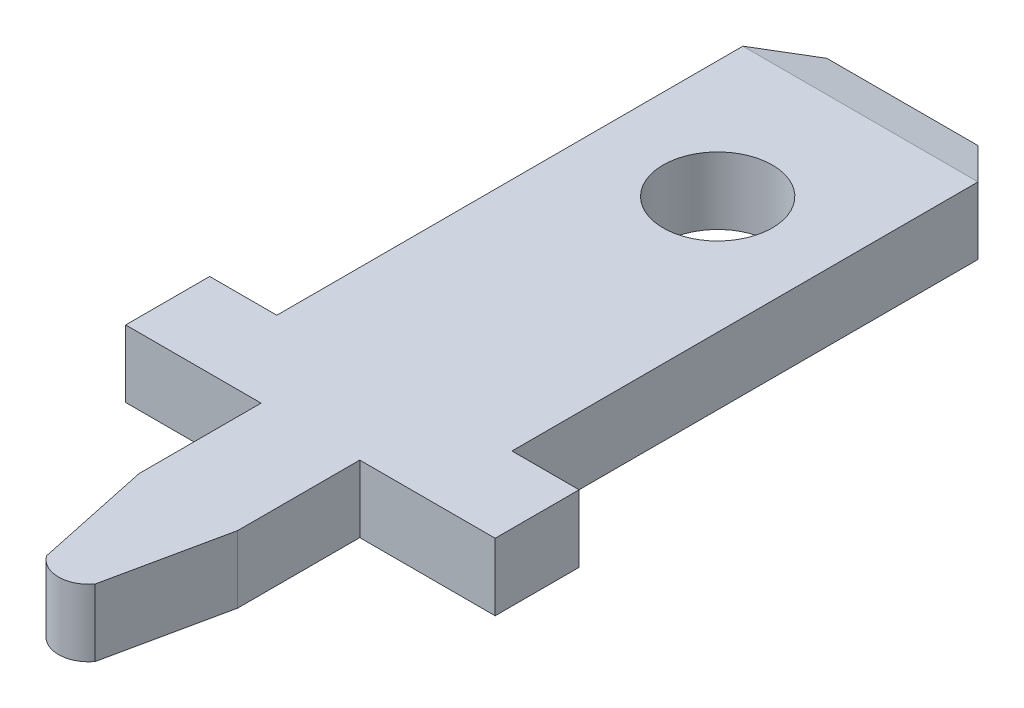
ISO-10303-21;
HEADER;
FILE_DESCRIPTION(('STEP AP214'),'2;1');
FILE_NAME('part.step','',(''),(''),'','','');
FILE_SCHEMA(('AUTOMOTIVE_DESIGN { 1 0 10303 214 1 1 1 1 }'));
ENDSEC;
DATA;
#1=APPLICATION_CONTEXT('core data for automotive mechanical design processes');
#2=APPLICATION_PROTOCOL_DEFINITION('international standard','automotive_design',2000,#1);
#3=PRODUCT_CONTEXT('',#1,'mechanical');
#4=PRODUCT('Part','Part','',(#3));
#5=PRODUCT_RELATED_PRODUCT_CATEGORY('part','',(#4));
#6=PRODUCT_DEFINITION_FORMATION('','',#4);
#7=PRODUCT_DEFINITION_CONTEXT('part definition',#1,'design');
#8=PRODUCT_DEFINITION('design','',#6,#7);
#9=PRODUCT_DEFINITION_SHAPE('','',#8);
#10=(LENGTH_UNIT() NAMED_UNIT(*) SI_UNIT(.MILLI.,.METRE.));
#11=(NAMED_UNIT(*) PLANE_ANGLE_UNIT() SI_UNIT($,.RADIAN.));
#12=(NAMED_UNIT(*) SI_UNIT($,.STERADIAN.) SOLID_ANGLE_UNIT());
#13=UNCERTAINTY_MEASURE_WITH_UNIT(LENGTH_MEASURE(1.E-05),#10,'distance_accuracy_value','');
#14=(GEOMETRIC_REPRESENTATION_CONTEXT(3) GLOBAL_UNCERTAINTY_ASSIGNED_CONTEXT((#13)) GLOBAL_UNIT_ASSIGNED_CONTEXT((#10,
#11,#12)) REPRESENTATION_CONTEXT('',''));
#15=CARTESIAN_POINT('',(0.,0.,0.));
#16=DIRECTION('',(0.,0.,1.));
#17=DIRECTION('',(1.,0.,0.));
#18=AXIS2_PLACEMENT_3D('',#15,#16,#17);
#19=CARTESIAN_POINT('',(-1.4,0.,-6.55));
#20=DIRECTION('',(0.,0.970142500145338,-0.242535625036309));
#21=DIRECTION('',(0.,0.242535625036309,0.970142500145338));
#22=AXIS2_PLACEMENT_3D('',#19,#20,#21);
#23=PLANE('',#22);
#24=DIRECTION('',(0.696310623822791,-0.174077655955698,-0.696310623822791));
#25=VECTOR('',#24,1.);
#26=CARTESIAN_POINT('',(-1.4,0.,-6.55));
#27=LINE('',#26,#25);
#28=CARTESIAN_POINT('',(-1.4,0.,-6.55));
#29=VERTEX_POINT('',#28);
#30=CARTESIAN_POINT('',(-0.9,-0.124999999999994,-7.05));
#31=VERTEX_POINT('',#30);
#32=EDGE_CURVE('E210',#29,#31,#27,.T.);
#33=ORIENTED_EDGE('',*,*,#32,.F.);
#34=DIRECTION('',(1.,0.,0.));
#35=VECTOR('',#34,1.);
#36=CARTESIAN_POINT('',(0.,0.,-6.55));
#37=LINE('',#36,#35);
#38=CARTESIAN_POINT('',(1.4,0.,-6.55));
#39=VERTEX_POINT('',#38);
#40=EDGE_CURVE('E191',#29,#39,#37,.T.);
#41=ORIENTED_EDGE('',*,*,#40,.T.);
#42=DIRECTION('',(0.696310623822791,0.174077655955698,0.696310623822791));
#43=VECTOR('',#42,1.);
#44=CARTESIAN_POINT('',(0.9,-0.125,-7.05));
#45=LINE('',#44,#43);
#46=CARTESIAN_POINT('',(0.9,-0.124999999999997,-7.05));
#47=VERTEX_POINT('',#46);
#48=EDGE_CURVE('E193',#47,#39,#45,.T.);
#49=ORIENTED_EDGE('',*,*,#48,.F.);
#50=DIRECTION('',(-1.,0.,0.));
#51=VECTOR('',#50,1.);
#52=CARTESIAN_POINT('',(-1.4,-0.125,-7.05));
#53=LINE('',#52,#51);
#54=EDGE_CURVE('E213',#31,#47,#53,.F.);
#55=ORIENTED_EDGE('',*,*,#54,.F.);
#56=EDGE_LOOP('',(#33,#41,#49,#55));
#57=FACE_BOUND('',#56,.T.);
#58=ADVANCED_FACE('F16',(#57),#23,.T.);
#59=CARTESIAN_POINT('',(-1.4,0.,-7.05));
#60=DIRECTION('',(0.,0.,-1.));
#61=DIRECTION('',(-1.,0.,0.));
#62=AXIS2_PLACEMENT_3D('',#59,#60,#61);
#63=PLANE('',#62);
#64=DIRECTION('',(0.,1.,0.));
#65=VECTOR('',#64,1.);
#66=CARTESIAN_POINT('',(-0.9,0.,-7.05));
#67=LINE('',#66,#65);
#68=CARTESIAN_POINT('',(-0.9,-0.675000000000003,-7.05));
#69=VERTEX_POINT('',#68);
#70=EDGE_CURVE('E207',#31,#69,#67,.F.);
#71=ORIENTED_EDGE('',*,*,#70,.F.);
#72=ORIENTED_EDGE('',*,*,#54,.T.);
#73=DIRECTION('',(0.,1.,0.));
#74=VECTOR('',#73,1.);
#75=CARTESIAN_POINT('',(0.9,0.,-7.05));
#76=LINE('',#75,#74);
#77=CARTESIAN_POINT('',(0.9,-0.675000000000003,-7.05));
#78=VERTEX_POINT('',#77);
#79=EDGE_CURVE('E204',#78,#47,#76,.T.);
#80=ORIENTED_EDGE('',*,*,#79,.F.);
#81=DIRECTION('',(1.,0.,0.));
#82=VECTOR('',#81,1.);
#83=CARTESIAN_POINT('',(-1.4,-0.675000000000012,-7.05));
#84=LINE('',#83,#82);
#85=EDGE_CURVE('E310',#78,#69,#84,.F.);
#86=ORIENTED_EDGE('',*,*,#85,.T.);
#87=EDGE_LOOP('',(#71,#72,#80,#86));
#88=FACE_BOUND('',#87,.T.);
#89=ADVANCED_FACE('F299',(#88),#63,.T.);
#90=CARTESIAN_POINT('',(-0.9,0.,-7.05));
#91=DIRECTION('',(-0.707106781186548,0.,-0.707106781186548));
#92=DIRECTION('',(-0.707106781186548,0.,0.707106781186548));
#93=AXIS2_PLACEMENT_3D('',#90,#91,#92);
#94=PLANE('',#93);
#95=ORIENTED_EDGE('',*,*,#32,.T.);
#96=ORIENTED_EDGE('',*,*,#70,.T.);
#97=DIRECTION('',(-0.696310623822791,-0.174077655955681,0.696310623822796));
#98=VECTOR('',#97,1.);
#99=CARTESIAN_POINT('',(-0.9,-0.675000000000012,-7.05));
#100=LINE('',#99,#98);
#101=CARTESIAN_POINT('',(-1.4,-0.8,-6.55));
#102=VERTEX_POINT('',#101);
#103=EDGE_CURVE('E326',#69,#102,#100,.T.);
#104=ORIENTED_EDGE('',*,*,#103,.T.);
#105=DIRECTION('',(0.,1.,0.));
#106=VECTOR('',#105,1.);
#107=CARTESIAN_POINT('',(-1.4,0.,-6.55));
#108=LINE('',#107,#106);
#109=EDGE_CURVE('E314',#29,#102,#108,.F.);
#110=ORIENTED_EDGE('',*,*,#109,.F.);
#111=EDGE_LOOP('',(#95,#96,#104,#110));
#112=FACE_BOUND('',#111,.T.);
#113=ADVANCED_FACE('F296',(#112),#94,.T.);
#114=CARTESIAN_POINT('',(1.4,0.,-6.55));
#115=DIRECTION('',(0.707106781186548,0.,-0.707106781186548));
#116=DIRECTION('',(-0.707106781186548,0.,-0.707106781186548));
#117=AXIS2_PLACEMENT_3D('',#114,#115,#116);
#118=PLANE('',#117);
#119=ORIENTED_EDGE('',*,*,#48,.T.);
#120=DIRECTION('',(0.,1.,0.));
#121=VECTOR('',#120,1.);
#122=CARTESIAN_POINT('',(1.4,0.,-6.55));
#123=LINE('',#122,#121);
#124=CARTESIAN_POINT('',(1.4,-0.8,-6.55));
#125=VERTEX_POINT('',#124);
#126=EDGE_CURVE('E321',#125,#39,#123,.T.);
#127=ORIENTED_EDGE('',*,*,#126,.F.);
#128=DIRECTION('',(-0.696310623822791,0.174077655955681,-0.696310623822796));
#129=VECTOR('',#128,1.);
#130=CARTESIAN_POINT('',(1.4,-0.8,-6.55));
#131=LINE('',#130,#129);
#132=EDGE_CURVE('E319',#125,#78,#131,.T.);
#133=ORIENTED_EDGE('',*,*,#132,.T.);
#134=ORIENTED_EDGE('',*,*,#79,.T.);
#135=EDGE_LOOP('',(#119,#127,#133,#134));
#136=FACE_BOUND('',#135,.T.);
#137=ADVANCED_FACE('F293',(#136),#118,.T.);
#138=CARTESIAN_POINT('',(0.,0.,0.));
#139=DIRECTION('',(0.,-1.,0.));
#140=DIRECTION('',(0.,0.,-1.));
#141=AXIS2_PLACEMENT_3D('',#138,#139,#140);
#142=PLANE('',#141);
#143=CARTESIAN_POINT('',(0.,0.,-4.85));
#144=DIRECTION('',(0.,-1.,0.));
#145=DIRECTION('',(0.,0.,-1.));
#146=AXIS2_PLACEMENT_3D('',#143,#144,#145);
#147=CIRCLE('',#146,0.65);
#148=CARTESIAN_POINT('',(0.,0.,-5.5));
#149=VERTEX_POINT('',#148);
#150=EDGE_CURVE('E177',#149,#149,#147,.T.);
#151=ORIENTED_EDGE('',*,*,#150,.T.);
#152=EDGE_LOOP('',(#151));
#153=FACE_BOUND('',#152,.T.);
#154=DIRECTION('',(-1.,0.,0.));
#155=VECTOR('',#154,1.);
#156=CARTESIAN_POINT('',(1.4,0.,-1.));
#157=LINE('',#156,#155);
#158=CARTESIAN_POINT('',(1.4,0.,-1.));
#159=VERTEX_POINT('',#158);
#160=CARTESIAN_POINT('',(2.2,0.,-1.));
#161=VERTEX_POINT('',#160);
#162=EDGE_CURVE('E378',#159,#161,#157,.F.);
#163=ORIENTED_EDGE('',*,*,#162,.F.);
#164=DIRECTION('',(0.,0.,-1.));
#165=VECTOR('',#164,1.);
#166=CARTESIAN_POINT('',(1.4,0.,-7.05));
#167=LINE('',#166,#165);
#168=EDGE_CURVE('E383',#39,#159,#167,.F.);
#169=ORIENTED_EDGE('',*,*,#168,.F.);
#170=ORIENTED_EDGE('',*,*,#40,.F.);
#171=DIRECTION('',(0.,0.,1.));
#172=VECTOR('',#171,1.);
#173=CARTESIAN_POINT('',(-1.4,0.,-1.));
#174=LINE('',#173,#172);
#175=CARTESIAN_POINT('',(-1.4,0.,-1.));
#176=VERTEX_POINT('',#175);
#177=EDGE_CURVE('E324',#176,#29,#174,.F.);
#178=ORIENTED_EDGE('',*,*,#177,.F.);
#179=DIRECTION('',(-1.,0.,0.));
#180=VECTOR('',#179,1.);
#181=CARTESIAN_POINT('',(-2.2,0.,-1.));
#182=LINE('',#181,#180);
#183=CARTESIAN_POINT('',(-2.2,0.,-1.));
#184=VERTEX_POINT('',#183);
#185=EDGE_CURVE('E337',#184,#176,#182,.F.);
#186=ORIENTED_EDGE('',*,*,#185,.F.);
#187=DIRECTION('',(0.,0.,1.));
#188=VECTOR('',#187,1.);
#189=CARTESIAN_POINT('',(-2.2,0.,0.));
#190=LINE('',#189,#188);
#191=CARTESIAN_POINT('',(-2.2,0.,0.));
#192=VERTEX_POINT('',#191);
#193=EDGE_CURVE('E342',#192,#184,#190,.F.);
#194=ORIENTED_EDGE('',*,*,#193,.F.);
#195=DIRECTION('',(1.,0.,0.));
#196=VECTOR('',#195,1.);
#197=CARTESIAN_POINT('',(-0.5875,0.,0.));
#198=LINE('',#197,#196);
#199=CARTESIAN_POINT('',(-0.5875,0.,0.));
#200=VERTEX_POINT('',#199);
#201=EDGE_CURVE('E346',#200,#192,#198,.F.);
#202=ORIENTED_EDGE('',*,*,#201,.F.);
#203=DIRECTION('',(0.,0.,1.));
#204=VECTOR('',#203,1.);
#205=CARTESIAN_POINT('',(-0.5875,0.,1.453414905303));
#206=LINE('',#205,#204);
#207=CARTESIAN_POINT('',(-0.587500000000029,0.,1.45341490530301));
#208=VERTEX_POINT('',#207);
#209=EDGE_CURVE('E144',#208,#200,#206,.F.);
#210=ORIENTED_EDGE('',*,*,#209,.F.);
#211=DIRECTION('',(0.207911690817799,0.,0.978147600733797));
#212=VECTOR('',#211,1.);
#213=CARTESIAN_POINT('',(-0.289920813662,0.,2.853414905303));
#214=LINE('',#213,#212);
#215=CARTESIAN_POINT('',(-0.289920813661974,0.,2.85341490530312));
#216=VERTEX_POINT('',#215);
#217=EDGE_CURVE('E140',#216,#208,#214,.F.);
#218=ORIENTED_EDGE('',*,*,#217,.F.);
#219=CARTESIAN_POINT('',(0.,0.,2.64));
#220=DIRECTION('',(0.,-1.,0.));
#221=DIRECTION('',(0.,0.,-1.));
#222=AXIS2_PLACEMENT_3D('',#219,#220,#221);
#223=CIRCLE('',#222,0.36);
#224=CARTESIAN_POINT('',(0.289920813661952,0.,2.85341490530324));
#225=VERTEX_POINT('',#224);
#226=EDGE_CURVE('E19',#225,#216,#223,.T.);
#227=ORIENTED_EDGE('',*,*,#226,.F.);
#228=DIRECTION('',(0.207911690817799,0.,-0.978147600733797));
#229=VECTOR('',#228,1.);
#230=CARTESIAN_POINT('',(0.5875,0.,1.453414905303));
#231=LINE('',#230,#229);
#232=CARTESIAN_POINT('',(0.5875,0.,1.453414905303));
#233=VERTEX_POINT('',#232);
#234=EDGE_CURVE('E126',#233,#225,#231,.F.);
#235=ORIENTED_EDGE('',*,*,#234,.F.);
#236=DIRECTION('',(0.,0.,-1.));
#237=VECTOR('',#236,1.);
#238=CARTESIAN_POINT('',(0.5875,0.,0.));
#239=LINE('',#238,#237);
#240=CARTESIAN_POINT('',(0.5875,0.,0.));
#241=VERTEX_POINT('',#240);
#242=EDGE_CURVE('E170',#241,#233,#239,.F.);
#243=ORIENTED_EDGE('',*,*,#242,.F.);
#244=DIRECTION('',(1.,0.,0.));
#245=VECTOR('',#244,1.);
#246=CARTESIAN_POINT('',(2.2,0.,0.));
#247=LINE('',#246,#245);
#248=CARTESIAN_POINT('',(2.2,0.,0.));
#249=VERTEX_POINT('',#248);
#250=EDGE_CURVE('E197',#249,#241,#247,.F.);
#251=ORIENTED_EDGE('',*,*,#250,.F.);
#252=DIRECTION('',(0.,0.,-1.));
#253=VECTOR('',#252,1.);
#254=CARTESIAN_POINT('',(2.2,0.,-1.));
#255=LINE('',#254,#253);
#256=EDGE_CURVE('E183',#161,#249,#255,.F.);
#257=ORIENTED_EDGE('',*,*,#256,.F.);
#258=EDGE_LOOP('',(#163,#169,#170,#178,#186,#194,#202,#210,#218,#227,#235,#243,#251,#257));
#259=FACE_BOUND('',#258,.T.);
#260=ADVANCED_FACE('F142',(#153,#259),#142,.F.);
#261=CARTESIAN_POINT('',(0.5875,0.,0.));
#262=DIRECTION('',(1.,0.,0.));
#263=DIRECTION('',(0.,0.,-1.));
#264=AXIS2_PLACEMENT_3D('',#261,#262,#263);
#265=PLANE('',#264);
#266=DIRECTION('',(0.,1.,0.));
#267=VECTOR('',#266,1.);
#268=CARTESIAN_POINT('',(0.5875,0.,0.));
#269=LINE('',#268,#267);
#270=CARTESIAN_POINT('',(0.5875,-0.8,0.));
#271=VERTEX_POINT('',#270);
#272=EDGE_CURVE('E180',#241,#271,#269,.F.);
#273=ORIENTED_EDGE('',*,*,#272,.F.);
#274=ORIENTED_EDGE('',*,*,#242,.T.);
#275=DIRECTION('',(0.,1.,0.));
#276=VECTOR('',#275,1.);
#277=CARTESIAN_POINT('',(0.5875,0.,1.453414905303));
#278=LINE('',#277,#276);
#279=CARTESIAN_POINT('',(0.5875,-0.8,1.45341490530299));
#280=VERTEX_POINT('',#279);
#281=EDGE_CURVE('E168',#280,#233,#278,.T.);
#282=ORIENTED_EDGE('',*,*,#281,.F.);
#283=DIRECTION('',(0.,0.,-1.));
#284=VECTOR('',#283,1.);
#285=CARTESIAN_POINT('',(0.5875,-0.8,0.));
#286=LINE('',#285,#284);
#287=EDGE_CURVE('E173',#271,#280,#286,.F.);
#288=ORIENTED_EDGE('',*,*,#287,.F.);
#289=EDGE_LOOP('',(#273,#274,#282,#288));
#290=FACE_BOUND('',#289,.T.);
#291=ADVANCED_FACE('F287',(#290),#265,.T.);
#292=CARTESIAN_POINT('',(0.5875,0.,1.453414905303));
#293=DIRECTION('',(0.978147600733797,0.,0.207911690817799));
#294=DIRECTION('',(0.207911690817799,0.,-0.978147600733797));
#295=AXIS2_PLACEMENT_3D('',#292,#293,#294);
#296=PLANE('',#295);
#297=ORIENTED_EDGE('',*,*,#281,.T.);
#298=ORIENTED_EDGE('',*,*,#234,.T.);
#299=DIRECTION('',(0.,-1.,0.));
#300=VECTOR('',#299,1.);
#301=CARTESIAN_POINT('',(0.289920813662084,0.,2.85341490530306));
#302=LINE('',#301,#300);
#303=CARTESIAN_POINT('',(0.289920813662016,-0.8,2.85341490530316));
#304=VERTEX_POINT('',#303);
#305=EDGE_CURVE('E137',#304,#225,#302,.F.);
#306=ORIENTED_EDGE('',*,*,#305,.F.);
#307=DIRECTION('',(-0.207911690817739,0.,0.97814760073381));
#308=VECTOR('',#307,1.);
#309=CARTESIAN_POINT('',(0.5875,-0.8,1.453414905303));
#310=LINE('',#309,#308);
#311=EDGE_CURVE('E176',#280,#304,#310,.T.);
#312=ORIENTED_EDGE('',*,*,#311,.F.);
#313=EDGE_LOOP('',(#297,#298,#306,#312));
#314=FACE_BOUND('',#313,.T.);
#315=ADVANCED_FACE('F284',(#314),#296,.T.);
#316=CARTESIAN_POINT('',(0.,0.,2.64));
#317=DIRECTION('',(0.,-1.,0.));
#318=DIRECTION('',(0.,0.,-1.));
#319=AXIS2_PLACEMENT_3D('',#316,#317,#318);
#320=CYLINDRICAL_SURFACE('',#319,0.36);
#321=ORIENTED_EDGE('',*,*,#305,.T.);
#322=ORIENTED_EDGE('',*,*,#226,.T.);
#323=DIRECTION('',(0.,1.,0.));
#324=VECTOR('',#323,1.);
#325=CARTESIAN_POINT('',(-0.289920813662,0.,2.853414905303));
#326=LINE('',#325,#324);
#327=CARTESIAN_POINT('',(-0.289920813661974,-0.8,2.85341490530312));
#328=VERTEX_POINT('',#327);
#329=EDGE_CURVE('E135',#328,#216,#326,.T.);
#330=ORIENTED_EDGE('',*,*,#329,.F.);
#331=CARTESIAN_POINT('',(0.,-0.8,2.64));
#332=DIRECTION('',(0.,-1.,0.));
#333=DIRECTION('',(0.,0.,-1.));
#334=AXIS2_PLACEMENT_3D('',#331,#332,#333);
#335=CIRCLE('',#334,0.36);
#336=EDGE_CURVE('E223',#304,#328,#335,.T.);
#337=ORIENTED_EDGE('',*,*,#336,.F.);
#338=EDGE_LOOP('',(#321,#322,#330,#337));
#339=FACE_BOUND('',#338,.T.);
#340=ADVANCED_FACE('F132',(#339),#320,.T.);
#341=CARTESIAN_POINT('',(-0.289920813662,0.,2.853414905303));
#342=DIRECTION('',(-0.978147600733797,0.,0.207911690817799));
#343=DIRECTION('',(0.207911690817799,0.,0.978147600733797));
#344=AXIS2_PLACEMENT_3D('',#341,#342,#343);
#345=PLANE('',#344);
#346=ORIENTED_EDGE('',*,*,#329,.T.);
#347=ORIENTED_EDGE('',*,*,#217,.T.);
#348=DIRECTION('',(0.,1.,0.));
#349=VECTOR('',#348,1.);
#350=CARTESIAN_POINT('',(-0.5875,0.,1.453414905303));
#351=LINE('',#350,#349);
#352=CARTESIAN_POINT('',(-0.5875,-0.8,1.453414905303));
#353=VERTEX_POINT('',#352);
#354=EDGE_CURVE('E147',#353,#208,#351,.T.);
#355=ORIENTED_EDGE('',*,*,#354,.F.);
#356=DIRECTION('',(-0.207911690817739,0.,-0.97814760073381));
#357=VECTOR('',#356,1.);
#358=CARTESIAN_POINT('',(-0.289920813662,-0.8,2.853414905303));
#359=LINE('',#358,#357);
#360=EDGE_CURVE('E151',#328,#353,#359,.T.);
#361=ORIENTED_EDGE('',*,*,#360,.F.);
#362=EDGE_LOOP('',(#346,#347,#355,#361));
#363=FACE_BOUND('',#362,.T.);
#364=ADVANCED_FACE('F149',(#363),#345,.T.);
#365=CARTESIAN_POINT('',(-0.5875,0.,1.453414905303));
#366=DIRECTION('',(-1.,0.,0.));
#367=DIRECTION('',(0.,0.,1.));
#368=AXIS2_PLACEMENT_3D('',#365,#366,#367);
#369=PLANE('',#368);
#370=ORIENTED_EDGE('',*,*,#354,.T.);
#371=ORIENTED_EDGE('',*,*,#209,.T.);
#372=DIRECTION('',(0.,1.,0.));
#373=VECTOR('',#372,1.);
#374=CARTESIAN_POINT('',(-0.5875,0.,0.));
#375=LINE('',#374,#373);
#376=CARTESIAN_POINT('',(-0.5875,-0.8,0.));
#377=VERTEX_POINT('',#376);
#378=EDGE_CURVE('E156',#377,#200,#375,.T.);
#379=ORIENTED_EDGE('',*,*,#378,.F.);
#380=DIRECTION('',(0.,0.,-1.));
#381=VECTOR('',#380,1.);
#382=CARTESIAN_POINT('',(-0.5875,-0.8,0.));
#383=LINE('',#382,#381);
#384=EDGE_CURVE('E158',#353,#377,#383,.T.);
#385=ORIENTED_EDGE('',*,*,#384,.F.);
#386=EDGE_LOOP('',(#370,#371,#379,#385));
#387=FACE_BOUND('',#386,.T.);
#388=ADVANCED_FACE('F275',(#387),#369,.T.);
#389=CARTESIAN_POINT('',(-0.5875,0.,0.));
#390=DIRECTION('',(0.,0.,1.));
#391=DIRECTION('',(1.,0.,0.));
#392=AXIS2_PLACEMENT_3D('',#389,#390,#391);
#393=PLANE('',#392);
#394=ORIENTED_EDGE('',*,*,#378,.T.);
#395=ORIENTED_EDGE('',*,*,#201,.T.);
#396=DIRECTION('',(0.,1.,0.));
#397=VECTOR('',#396,1.);
#398=CARTESIAN_POINT('',(-2.2,0.,0.));
#399=LINE('',#398,#397);
#400=CARTESIAN_POINT('',(-2.2,-0.8,0.));
#401=VERTEX_POINT('',#400);
#402=EDGE_CURVE('E344',#401,#192,#399,.T.);
#403=ORIENTED_EDGE('',*,*,#402,.F.);
#404=DIRECTION('',(1.,0.,0.));
#405=VECTOR('',#404,1.);
#406=CARTESIAN_POINT('',(0.,-0.8,0.));
#407=LINE('',#406,#405);
#408=EDGE_CURVE('E161',#377,#401,#407,.F.);
#409=ORIENTED_EDGE('',*,*,#408,.F.);
#410=EDGE_LOOP('',(#394,#395,#403,#409));
#411=FACE_BOUND('',#410,.T.);
#412=ADVANCED_FACE('F271',(#411),#393,.T.);
#413=CARTESIAN_POINT('',(-2.2,0.,0.));
#414=DIRECTION('',(-1.,0.,0.));
#415=DIRECTION('',(0.,0.,1.));
#416=AXIS2_PLACEMENT_3D('',#413,#414,#415);
#417=PLANE('',#416);
#418=ORIENTED_EDGE('',*,*,#402,.T.);
#419=ORIENTED_EDGE('',*,*,#193,.T.);
#420=DIRECTION('',(0.,1.,0.));
#421=VECTOR('',#420,1.);
#422=CARTESIAN_POINT('',(-2.2,0.,-1.));
#423=LINE('',#422,#421);
#424=CARTESIAN_POINT('',(-2.2,-0.8,-1.));
#425=VERTEX_POINT('',#424);
#426=EDGE_CURVE('E339',#425,#184,#423,.T.);
#427=ORIENTED_EDGE('',*,*,#426,.F.);
#428=DIRECTION('',(0.,0.,-1.));
#429=VECTOR('',#428,1.);
#430=CARTESIAN_POINT('',(-2.2,-0.8,0.));
#431=LINE('',#430,#429);
#432=EDGE_CURVE('E356',#401,#425,#431,.T.);
#433=ORIENTED_EDGE('',*,*,#432,.F.);
#434=EDGE_LOOP('',(#418,#419,#427,#433));
#435=FACE_BOUND('',#434,.T.);
#436=ADVANCED_FACE('F267',(#435),#417,.T.);
#437=CARTESIAN_POINT('',(-2.2,0.,-1.));
#438=DIRECTION('',(0.,0.,-1.));
#439=DIRECTION('',(-1.,0.,0.));
#440=AXIS2_PLACEMENT_3D('',#437,#438,#439);
#441=PLANE('',#440);
#442=ORIENTED_EDGE('',*,*,#426,.T.);
#443=ORIENTED_EDGE('',*,*,#185,.T.);
#444=DIRECTION('',(0.,1.,0.));
#445=VECTOR('',#444,1.);
#446=CARTESIAN_POINT('',(-1.4,0.,-1.));
#447=LINE('',#446,#445);
#448=CARTESIAN_POINT('',(-1.4,-0.8,-1.));
#449=VERTEX_POINT('',#448);
#450=EDGE_CURVE('E333',#449,#176,#447,.T.);
#451=ORIENTED_EDGE('',*,*,#450,.F.);
#452=DIRECTION('',(1.,0.,0.));
#453=VECTOR('',#452,1.);
#454=CARTESIAN_POINT('',(0.,-0.8,-1.));
#455=LINE('',#454,#453);
#456=EDGE_CURVE('E360',#425,#449,#455,.T.);
#457=ORIENTED_EDGE('',*,*,#456,.F.);
#458=EDGE_LOOP('',(#442,#443,#451,#457));
#459=FACE_BOUND('',#458,.T.);
#460=ADVANCED_FACE('F263',(#459),#441,.T.);
#461=CARTESIAN_POINT('',(-1.4,0.,-1.));
#462=DIRECTION('',(-1.,0.,0.));
#463=DIRECTION('',(0.,0.,1.));
#464=AXIS2_PLACEMENT_3D('',#461,#462,#463);
#465=PLANE('',#464);
#466=ORIENTED_EDGE('',*,*,#450,.T.);
#467=ORIENTED_EDGE('',*,*,#177,.T.);
#468=ORIENTED_EDGE('',*,*,#109,.T.);
#469=DIRECTION('',(0.,0.,-1.));
#470=VECTOR('',#469,1.);
#471=CARTESIAN_POINT('',(-1.4,-0.8,0.));
#472=LINE('',#471,#470);
#473=EDGE_CURVE('E394',#449,#102,#472,.T.);
#474=ORIENTED_EDGE('',*,*,#473,.F.);
#475=EDGE_LOOP('',(#466,#467,#468,#474));
#476=FACE_BOUND('',#475,.T.);
#477=ADVANCED_FACE('F259',(#476),#465,.T.);
#478=CARTESIAN_POINT('',(-1.4,-0.8,-6.55));
#479=DIRECTION('',(0.,0.970142500145338,0.242535625036309));
#480=DIRECTION('',(0.,-0.242535625036309,0.970142500145338));
#481=AXIS2_PLACEMENT_3D('',#478,#479,#480);
#482=PLANE('',#481);
#483=ORIENTED_EDGE('',*,*,#85,.F.);
#484=ORIENTED_EDGE('',*,*,#132,.F.);
#485=DIRECTION('',(1.,0.,0.));
#486=VECTOR('',#485,1.);
#487=CARTESIAN_POINT('',(0.,-0.8,-6.55));
#488=LINE('',#487,#486);
#489=EDGE_CURVE('E390',#102,#125,#488,.T.);
#490=ORIENTED_EDGE('',*,*,#489,.F.);
#491=ORIENTED_EDGE('',*,*,#103,.F.);
#492=EDGE_LOOP('',(#483,#484,#490,#491));
#493=FACE_BOUND('',#492,.T.);
#494=ADVANCED_FACE('F255',(#493),#482,.F.);
#495=CARTESIAN_POINT('',(1.4,0.,-7.05));
#496=DIRECTION('',(1.,0.,0.));
#497=DIRECTION('',(0.,0.,-1.));
#498=AXIS2_PLACEMENT_3D('',#495,#496,#497);
#499=PLANE('',#498);
#500=ORIENTED_EDGE('',*,*,#126,.T.);
#501=ORIENTED_EDGE('',*,*,#168,.T.);
#502=DIRECTION('',(0.,1.,0.));
#503=VECTOR('',#502,1.);
#504=CARTESIAN_POINT('',(1.4,0.,-1.));
#505=LINE('',#504,#503);
#506=CARTESIAN_POINT('',(1.4,-0.8,-1.));
#507=VERTEX_POINT('',#506);
#508=EDGE_CURVE('E380',#507,#159,#505,.T.);
#509=ORIENTED_EDGE('',*,*,#508,.F.);
#510=DIRECTION('',(0.,0.,-1.));
#511=VECTOR('',#510,1.);
#512=CARTESIAN_POINT('',(1.4,-0.8,0.));
#513=LINE('',#512,#511);
#514=EDGE_CURVE('E385',#125,#507,#513,.F.);
#515=ORIENTED_EDGE('',*,*,#514,.F.);
#516=EDGE_LOOP('',(#500,#501,#509,#515));
#517=FACE_BOUND('',#516,.T.);
#518=ADVANCED_FACE('F251',(#517),#499,.T.);
#519=CARTESIAN_POINT('',(1.4,0.,-1.));
#520=DIRECTION('',(0.,0.,-1.));
#521=DIRECTION('',(-1.,0.,0.));
#522=AXIS2_PLACEMENT_3D('',#519,#520,#521);
#523=PLANE('',#522);
#524=ORIENTED_EDGE('',*,*,#508,.T.);
#525=ORIENTED_EDGE('',*,*,#162,.T.);
#526=DIRECTION('',(0.,1.,0.));
#527=VECTOR('',#526,1.);
#528=CARTESIAN_POINT('',(2.2,0.,-1.));
#529=LINE('',#528,#527);
#530=CARTESIAN_POINT('',(2.2,-0.8,-1.));
#531=VERTEX_POINT('',#530);
#532=EDGE_CURVE('E375',#531,#161,#529,.T.);
#533=ORIENTED_EDGE('',*,*,#532,.F.);
#534=DIRECTION('',(1.,0.,0.));
#535=VECTOR('',#534,1.);
#536=CARTESIAN_POINT('',(0.,-0.8,-1.));
#537=LINE('',#536,#535);
#538=EDGE_CURVE('E389',#507,#531,#537,.T.);
#539=ORIENTED_EDGE('',*,*,#538,.F.);
#540=EDGE_LOOP('',(#524,#525,#533,#539));
#541=FACE_BOUND('',#540,.T.);
#542=ADVANCED_FACE('F248',(#541),#523,.T.);
#543=CARTESIAN_POINT('',(2.2,0.,-1.));
#544=DIRECTION('',(1.,0.,0.));
#545=DIRECTION('',(0.,0.,-1.));
#546=AXIS2_PLACEMENT_3D('',#543,#544,#545);
#547=PLANE('',#546);
#548=ORIENTED_EDGE('',*,*,#532,.T.);
#549=ORIENTED_EDGE('',*,*,#256,.T.);
#550=DIRECTION('',(0.,1.,0.));
#551=VECTOR('',#550,1.);
#552=CARTESIAN_POINT('',(2.2,0.,0.));
#553=LINE('',#552,#551);
#554=CARTESIAN_POINT('',(2.2,-0.8,0.));
#555=VERTEX_POINT('',#554);
#556=EDGE_CURVE('E34',#555,#249,#553,.T.);
#557=ORIENTED_EDGE('',*,*,#556,.F.);
#558=DIRECTION('',(0.,0.,-1.));
#559=VECTOR('',#558,1.);
#560=CARTESIAN_POINT('',(2.2,-0.8,0.));
#561=LINE('',#560,#559);
#562=EDGE_CURVE('E188',#531,#555,#561,.F.);
#563=ORIENTED_EDGE('',*,*,#562,.F.);
#564=EDGE_LOOP('',(#548,#549,#557,#563));
#565=FACE_BOUND('',#564,.T.);
#566=ADVANCED_FACE('F241',(#565),#547,.T.);
#567=CARTESIAN_POINT('',(2.2,0.,0.));
#568=DIRECTION('',(0.,0.,1.));
#569=DIRECTION('',(1.,0.,0.));
#570=AXIS2_PLACEMENT_3D('',#567,#568,#569);
#571=PLANE('',#570);
#572=ORIENTED_EDGE('',*,*,#556,.T.);
#573=ORIENTED_EDGE('',*,*,#250,.T.);
#574=ORIENTED_EDGE('',*,*,#272,.T.);
#575=DIRECTION('',(1.,0.,0.));
#576=VECTOR('',#575,1.);
#577=CARTESIAN_POINT('',(0.,-0.8,0.));
#578=LINE('',#577,#576);
#579=EDGE_CURVE('E25',#555,#271,#578,.F.);
#580=ORIENTED_EDGE('',*,*,#579,.F.);
#581=EDGE_LOOP('',(#572,#573,#574,#580));
#582=FACE_BOUND('',#581,.T.);
#583=ADVANCED_FACE('F231',(#582),#571,.T.);
#584=CARTESIAN_POINT('',(0.,0.,-4.85));
#585=DIRECTION('',(0.,-1.,0.));
#586=DIRECTION('',(0.,0.,-1.));
#587=AXIS2_PLACEMENT_3D('',#584,#585,#586);
#588=CYLINDRICAL_SURFACE('',#587,0.65);
#589=CARTESIAN_POINT('',(0.,-0.8,-4.85));
#590=DIRECTION('',(0.,-1.,0.));
#591=DIRECTION('',(0.,0.,-1.));
#592=AXIS2_PLACEMENT_3D('',#589,#590,#591);
#593=CIRCLE('',#592,0.65);
#594=CARTESIAN_POINT('',(0.,-0.8,-5.5));
#595=VERTEX_POINT('',#594);
#596=EDGE_CURVE('E10',#595,#595,#593,.F.);
#597=ORIENTED_EDGE('',*,*,#596,.F.);
#598=EDGE_LOOP('',(#597));
#599=FACE_BOUND('',#598,.T.);
#600=ORIENTED_EDGE('',*,*,#150,.F.);
#601=EDGE_LOOP('',(#600));
#602=FACE_BOUND('',#601,.T.);
#603=ADVANCED_FACE('F228',(#599,#602),#588,.F.);
#604=CARTESIAN_POINT('',(0.,-0.8,0.));
#605=DIRECTION('',(0.,-1.,0.));
#606=DIRECTION('',(0.,0.,-1.));
#607=AXIS2_PLACEMENT_3D('',#604,#605,#606);
#608=PLANE('',#607);
#609=ORIENTED_EDGE('',*,*,#596,.T.);
#610=EDGE_LOOP('',(#609));
#611=FACE_BOUND('',#610,.T.);
#612=ORIENTED_EDGE('',*,*,#562,.T.);
#613=ORIENTED_EDGE('',*,*,#579,.T.);
#614=ORIENTED_EDGE('',*,*,#287,.T.);
#615=ORIENTED_EDGE('',*,*,#311,.T.);
#616=ORIENTED_EDGE('',*,*,#336,.T.);
#617=ORIENTED_EDGE('',*,*,#360,.T.);
#618=ORIENTED_EDGE('',*,*,#384,.T.);
#619=ORIENTED_EDGE('',*,*,#408,.T.);
#620=ORIENTED_EDGE('',*,*,#432,.T.);
#621=ORIENTED_EDGE('',*,*,#456,.T.);
#622=ORIENTED_EDGE('',*,*,#473,.T.);
#623=ORIENTED_EDGE('',*,*,#489,.T.);
#624=ORIENTED_EDGE('',*,*,#514,.T.);
#625=ORIENTED_EDGE('',*,*,#538,.T.);
#626=EDGE_LOOP('',(#612,#613,#614,#615,#616,#617,#618,#619,#620,#621,#622,#623,#624,#625));
#627=FACE_BOUND('',#626,.T.);
#628=ADVANCED_FACE('F230',(#611,#627),#608,.T.);
#629=CLOSED_SHELL('',(#58,#89,#113,#137,#260,#291,#315,#340,#364,#388,#412,#436,#460,#477,#494,
#518,#542,#566,#583,#603,#628));
#630=MANIFOLD_SOLID_BREP('B1',#629);
#631=ADVANCED_BREP_SHAPE_REPRESENTATION('',(#18,#630),#14);
#632=SHAPE_DEFINITION_REPRESENTATION(#9,#631);
ENDSEC;
END-ISO-10303-21;
